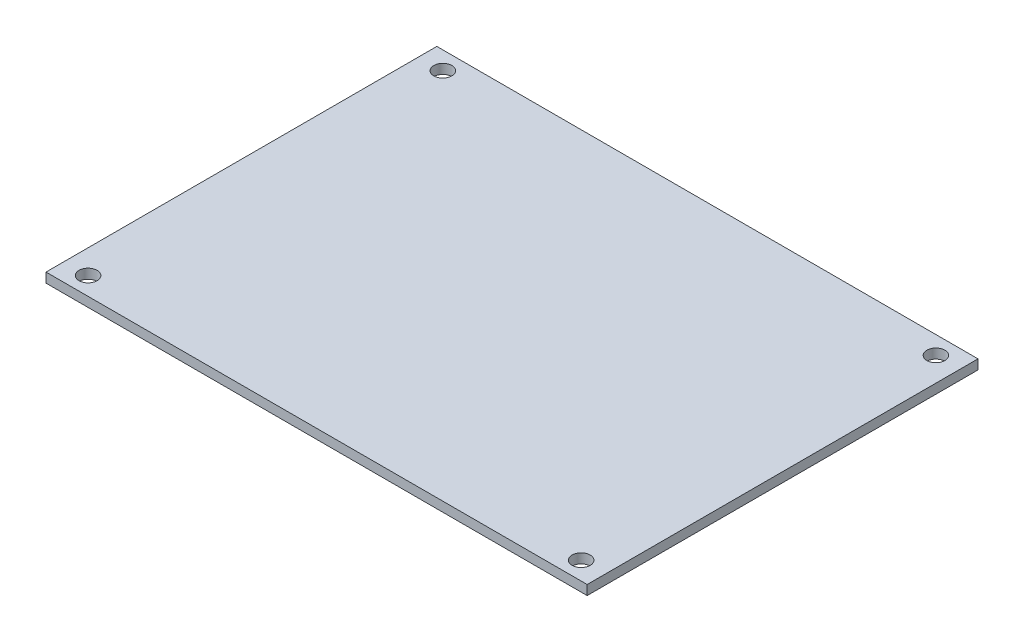
ISO-10303-21;
HEADER;
FILE_DESCRIPTION(('STEP AP214'),'2;1');
FILE_NAME('part.step','',(''),(''),'','','');
FILE_SCHEMA(('AUTOMOTIVE_DESIGN { 1 0 10303 214 1 1 1 1 }'));
ENDSEC;
DATA;
#1=APPLICATION_CONTEXT('core data for automotive mechanical design processes');
#2=APPLICATION_PROTOCOL_DEFINITION('international standard','automotive_design',2000,#1);
#3=PRODUCT_CONTEXT('',#1,'mechanical');
#4=PRODUCT('Part','Part','',(#3));
#5=PRODUCT_RELATED_PRODUCT_CATEGORY('part','',(#4));
#6=PRODUCT_DEFINITION_FORMATION('','',#4);
#7=PRODUCT_DEFINITION_CONTEXT('part definition',#1,'design');
#8=PRODUCT_DEFINITION('design','',#6,#7);
#9=PRODUCT_DEFINITION_SHAPE('','',#8);
#10=(LENGTH_UNIT() NAMED_UNIT(*) SI_UNIT(.MILLI.,.METRE.));
#11=(NAMED_UNIT(*) PLANE_ANGLE_UNIT() SI_UNIT($,.RADIAN.));
#12=(NAMED_UNIT(*) SI_UNIT($,.STERADIAN.) SOLID_ANGLE_UNIT());
#13=UNCERTAINTY_MEASURE_WITH_UNIT(LENGTH_MEASURE(1.E-05),#10,'distance_accuracy_value','');
#14=(GEOMETRIC_REPRESENTATION_CONTEXT(3) GLOBAL_UNCERTAINTY_ASSIGNED_CONTEXT((#13)) GLOBAL_UNIT_ASSIGNED_CONTEXT((#10,
#11,#12)) REPRESENTATION_CONTEXT('',''));
#15=CARTESIAN_POINT('',(0.,0.,0.));
#16=DIRECTION('',(0.,0.,1.));
#17=DIRECTION('',(1.,0.,0.));
#18=AXIS2_PLACEMENT_3D('',#15,#16,#17);
#19=CARTESIAN_POINT('',(0.,1.6,0.));
#20=DIRECTION('',(0.,-1.,0.));
#21=DIRECTION('',(0.,0.,-1.));
#22=AXIS2_PLACEMENT_3D('',#19,#20,#21);
#23=PLANE('',#22);
#24=DIRECTION('',(0.,0.,1.));
#25=VECTOR('',#24,1.);
#26=CARTESIAN_POINT('',(0.,1.6,0.));
#27=LINE('',#26,#25);
#28=CARTESIAN_POINT('',(0.,1.6,-65.));
#29=VERTEX_POINT('',#28);
#30=CARTESIAN_POINT('',(0.,1.6,0.));
#31=VERTEX_POINT('',#30);
#32=EDGE_CURVE('E92',#29,#31,#27,.T.);
#33=ORIENTED_EDGE('',*,*,#32,.T.);
#34=DIRECTION('',(1.,0.,0.));
#35=VECTOR('',#34,1.);
#36=CARTESIAN_POINT('',(0.,1.6,0.));
#37=LINE('',#36,#35);
#38=CARTESIAN_POINT('',(90.,1.6,0.));
#39=VERTEX_POINT('',#38);
#40=EDGE_CURVE('E87',#31,#39,#37,.T.);
#41=ORIENTED_EDGE('',*,*,#40,.T.);
#42=DIRECTION('',(0.,0.,-1.));
#43=VECTOR('',#42,1.);
#44=CARTESIAN_POINT('',(90.,1.6,0.));
#45=LINE('',#44,#43);
#46=CARTESIAN_POINT('',(90.,1.6,-65.));
#47=VERTEX_POINT('',#46);
#48=EDGE_CURVE('E90',#39,#47,#45,.T.);
#49=ORIENTED_EDGE('',*,*,#48,.T.);
#50=DIRECTION('',(-1.,0.,0.));
#51=VECTOR('',#50,1.);
#52=CARTESIAN_POINT('',(0.,1.6,-65.));
#53=LINE('',#52,#51);
#54=EDGE_CURVE('E57',#47,#29,#53,.T.);
#55=ORIENTED_EDGE('',*,*,#54,.T.);
#56=EDGE_LOOP('',(#33,#41,#49,#55));
#57=FACE_BOUND('',#56,.T.);
#58=CARTESIAN_POINT('',(4.,1.6,-3.));
#59=DIRECTION('',(0.,1.,0.));
#60=DIRECTION('',(0.,0.,1.));
#61=AXIS2_PLACEMENT_3D('',#58,#59,#60);
#62=CIRCLE('',#61,1.5);
#63=CARTESIAN_POINT('',(4.,1.6,-1.5));
#64=VERTEX_POINT('',#63);
#65=EDGE_CURVE('E112',#64,#64,#62,.T.);
#66=ORIENTED_EDGE('',*,*,#65,.F.);
#67=EDGE_LOOP('',(#66));
#68=FACE_BOUND('',#67,.T.);
#69=CARTESIAN_POINT('',(86.,1.6,-3.));
#70=DIRECTION('',(0.,1.,0.));
#71=DIRECTION('',(0.,0.,1.));
#72=AXIS2_PLACEMENT_3D('',#69,#70,#71);
#73=CIRCLE('',#72,1.5);
#74=CARTESIAN_POINT('',(86.,1.6,-1.5));
#75=VERTEX_POINT('',#74);
#76=EDGE_CURVE('E134',#75,#75,#73,.T.);
#77=ORIENTED_EDGE('',*,*,#76,.F.);
#78=EDGE_LOOP('',(#77));
#79=FACE_BOUND('',#78,.T.);
#80=CARTESIAN_POINT('',(4.,1.6,-62.));
#81=DIRECTION('',(0.,1.,0.));
#82=DIRECTION('',(0.,0.,1.));
#83=AXIS2_PLACEMENT_3D('',#80,#81,#82);
#84=CIRCLE('',#83,1.5);
#85=CARTESIAN_POINT('',(4.,1.6,-60.5));
#86=VERTEX_POINT('',#85);
#87=EDGE_CURVE('E142',#86,#86,#84,.T.);
#88=ORIENTED_EDGE('',*,*,#87,.F.);
#89=EDGE_LOOP('',(#88));
#90=FACE_BOUND('',#89,.T.);
#91=CARTESIAN_POINT('',(86.,1.6,-62.));
#92=DIRECTION('',(0.,1.,0.));
#93=DIRECTION('',(0.,0.,1.));
#94=AXIS2_PLACEMENT_3D('',#91,#92,#93);
#95=CIRCLE('',#94,1.5);
#96=CARTESIAN_POINT('',(86.,1.6,-60.5));
#97=VERTEX_POINT('',#96);
#98=EDGE_CURVE('E150',#97,#97,#95,.T.);
#99=ORIENTED_EDGE('',*,*,#98,.F.);
#100=EDGE_LOOP('',(#99));
#101=FACE_BOUND('',#100,.T.);
#102=ADVANCED_FACE('F39',(#57,#68,#79,#90,#101),#23,.F.);
#103=CARTESIAN_POINT('',(0.,0.,0.));
#104=DIRECTION('',(0.,-1.,0.));
#105=DIRECTION('',(0.,0.,-1.));
#106=AXIS2_PLACEMENT_3D('',#103,#104,#105);
#107=PLANE('',#106);
#108=CARTESIAN_POINT('',(4.,0.,-62.));
#109=DIRECTION('',(0.,1.,0.));
#110=DIRECTION('',(0.,0.,1.));
#111=AXIS2_PLACEMENT_3D('',#108,#109,#110);
#112=CIRCLE('',#111,1.5);
#113=CARTESIAN_POINT('',(4.,0.,-60.5));
#114=VERTEX_POINT('',#113);
#115=EDGE_CURVE('E146',#114,#114,#112,.T.);
#116=ORIENTED_EDGE('',*,*,#115,.T.);
#117=EDGE_LOOP('',(#116));
#118=FACE_BOUND('',#117,.T.);
#119=CARTESIAN_POINT('',(4.,0.,-3.));
#120=DIRECTION('',(0.,1.,0.));
#121=DIRECTION('',(0.,0.,1.));
#122=AXIS2_PLACEMENT_3D('',#119,#120,#121);
#123=CIRCLE('',#122,1.5);
#124=CARTESIAN_POINT('',(4.,0.,-1.5));
#125=VERTEX_POINT('',#124);
#126=EDGE_CURVE('E130',#125,#125,#123,.T.);
#127=ORIENTED_EDGE('',*,*,#126,.T.);
#128=EDGE_LOOP('',(#127));
#129=FACE_BOUND('',#128,.T.);
#130=DIRECTION('',(0.,0.,1.));
#131=VECTOR('',#130,1.);
#132=CARTESIAN_POINT('',(0.,0.,0.));
#133=LINE('',#132,#131);
#134=CARTESIAN_POINT('',(0.,0.,-65.));
#135=VERTEX_POINT('',#134);
#136=CARTESIAN_POINT('',(0.,0.,0.));
#137=VERTEX_POINT('',#136);
#138=EDGE_CURVE('E108',#135,#137,#133,.T.);
#139=ORIENTED_EDGE('',*,*,#138,.F.);
#140=DIRECTION('',(-1.,0.,0.));
#141=VECTOR('',#140,1.);
#142=CARTESIAN_POINT('',(0.,0.,-65.));
#143=LINE('',#142,#141);
#144=CARTESIAN_POINT('',(90.,0.,-65.));
#145=VERTEX_POINT('',#144);
#146=EDGE_CURVE('E80',#145,#135,#143,.T.);
#147=ORIENTED_EDGE('',*,*,#146,.F.);
#148=DIRECTION('',(0.,0.,-1.));
#149=VECTOR('',#148,1.);
#150=CARTESIAN_POINT('',(90.,0.,0.));
#151=LINE('',#150,#149);
#152=CARTESIAN_POINT('',(90.,0.,0.));
#153=VERTEX_POINT('',#152);
#154=EDGE_CURVE('E74',#153,#145,#151,.T.);
#155=ORIENTED_EDGE('',*,*,#154,.F.);
#156=DIRECTION('',(1.,0.,0.));
#157=VECTOR('',#156,1.);
#158=CARTESIAN_POINT('',(0.,0.,0.));
#159=LINE('',#158,#157);
#160=EDGE_CURVE('E97',#137,#153,#159,.T.);
#161=ORIENTED_EDGE('',*,*,#160,.F.);
#162=EDGE_LOOP('',(#139,#147,#155,#161));
#163=FACE_BOUND('',#162,.T.);
#164=CARTESIAN_POINT('',(86.,0.,-3.));
#165=DIRECTION('',(0.,1.,0.));
#166=DIRECTION('',(0.,0.,1.));
#167=AXIS2_PLACEMENT_3D('',#164,#165,#166);
#168=CIRCLE('',#167,1.5);
#169=CARTESIAN_POINT('',(86.,0.,-1.5));
#170=VERTEX_POINT('',#169);
#171=EDGE_CURVE('E138',#170,#170,#168,.T.);
#172=ORIENTED_EDGE('',*,*,#171,.T.);
#173=EDGE_LOOP('',(#172));
#174=FACE_BOUND('',#173,.T.);
#175=CARTESIAN_POINT('',(86.,0.,-62.));
#176=DIRECTION('',(0.,1.,0.));
#177=DIRECTION('',(0.,0.,1.));
#178=AXIS2_PLACEMENT_3D('',#175,#176,#177);
#179=CIRCLE('',#178,1.5);
#180=CARTESIAN_POINT('',(86.,0.,-60.5));
#181=VERTEX_POINT('',#180);
#182=EDGE_CURVE('E154',#181,#181,#179,.T.);
#183=ORIENTED_EDGE('',*,*,#182,.T.);
#184=EDGE_LOOP('',(#183));
#185=FACE_BOUND('',#184,.T.);
#186=ADVANCED_FACE('F125',(#118,#129,#163,#174,#185),#107,.T.);
#187=CARTESIAN_POINT('',(0.,1.6,0.));
#188=DIRECTION('',(1.,0.,0.));
#189=DIRECTION('',(0.,0.,-1.));
#190=AXIS2_PLACEMENT_3D('',#187,#188,#189);
#191=PLANE('',#190);
#192=ORIENTED_EDGE('',*,*,#138,.T.);
#193=DIRECTION('',(0.,-1.,0.));
#194=VECTOR('',#193,1.);
#195=CARTESIAN_POINT('',(0.,1.6,0.));
#196=LINE('',#195,#194);
#197=EDGE_CURVE('E11',#31,#137,#196,.T.);
#198=ORIENTED_EDGE('',*,*,#197,.F.);
#199=ORIENTED_EDGE('',*,*,#32,.F.);
#200=DIRECTION('',(0.,-1.,0.));
#201=VECTOR('',#200,1.);
#202=CARTESIAN_POINT('',(0.,1.6,-65.));
#203=LINE('',#202,#201);
#204=EDGE_CURVE('E104',#29,#135,#203,.T.);
#205=ORIENTED_EDGE('',*,*,#204,.T.);
#206=EDGE_LOOP('',(#192,#198,#199,#205));
#207=FACE_BOUND('',#206,.T.);
#208=ADVANCED_FACE('F41',(#207),#191,.F.);
#209=CARTESIAN_POINT('',(0.,1.6,0.));
#210=DIRECTION('',(0.,0.,-1.));
#211=DIRECTION('',(-1.,0.,0.));
#212=AXIS2_PLACEMENT_3D('',#209,#210,#211);
#213=PLANE('',#212);
#214=ORIENTED_EDGE('',*,*,#160,.T.);
#215=DIRECTION('',(0.,-1.,0.));
#216=VECTOR('',#215,1.);
#217=CARTESIAN_POINT('',(90.,1.6,0.));
#218=LINE('',#217,#216);
#219=EDGE_CURVE('E49',#39,#153,#218,.T.);
#220=ORIENTED_EDGE('',*,*,#219,.F.);
#221=ORIENTED_EDGE('',*,*,#40,.F.);
#222=ORIENTED_EDGE('',*,*,#197,.T.);
#223=EDGE_LOOP('',(#214,#220,#221,#222));
#224=FACE_BOUND('',#223,.T.);
#225=ADVANCED_FACE('F96',(#224),#213,.F.);
#226=CARTESIAN_POINT('',(90.,1.6,0.));
#227=DIRECTION('',(-1.,0.,0.));
#228=DIRECTION('',(0.,0.,1.));
#229=AXIS2_PLACEMENT_3D('',#226,#227,#228);
#230=PLANE('',#229);
#231=ORIENTED_EDGE('',*,*,#154,.T.);
#232=DIRECTION('',(0.,-1.,0.));
#233=VECTOR('',#232,1.);
#234=CARTESIAN_POINT('',(90.,1.6,-65.));
#235=LINE('',#234,#233);
#236=EDGE_CURVE('E99',#47,#145,#235,.T.);
#237=ORIENTED_EDGE('',*,*,#236,.F.);
#238=ORIENTED_EDGE('',*,*,#48,.F.);
#239=ORIENTED_EDGE('',*,*,#219,.T.);
#240=EDGE_LOOP('',(#231,#237,#238,#239));
#241=FACE_BOUND('',#240,.T.);
#242=ADVANCED_FACE('F100',(#241),#230,.F.);
#243=CARTESIAN_POINT('',(0.,1.6,-65.));
#244=DIRECTION('',(0.,0.,1.));
#245=DIRECTION('',(1.,0.,0.));
#246=AXIS2_PLACEMENT_3D('',#243,#244,#245);
#247=PLANE('',#246);
#248=ORIENTED_EDGE('',*,*,#146,.T.);
#249=ORIENTED_EDGE('',*,*,#204,.F.);
#250=ORIENTED_EDGE('',*,*,#54,.F.);
#251=ORIENTED_EDGE('',*,*,#236,.T.);
#252=EDGE_LOOP('',(#248,#249,#250,#251));
#253=FACE_BOUND('',#252,.T.);
#254=ADVANCED_FACE('F122',(#253),#247,.F.);
#255=CARTESIAN_POINT('',(4.,1.6,-3.));
#256=DIRECTION('',(0.,-1.,0.));
#257=DIRECTION('',(0.,0.,-1.));
#258=AXIS2_PLACEMENT_3D('',#255,#256,#257);
#259=CYLINDRICAL_SURFACE('',#258,1.5);
#260=ORIENTED_EDGE('',*,*,#65,.T.);
#261=EDGE_LOOP('',(#260));
#262=FACE_BOUND('',#261,.T.);
#263=ORIENTED_EDGE('',*,*,#126,.F.);
#264=EDGE_LOOP('',(#263));
#265=FACE_BOUND('',#264,.T.);
#266=ADVANCED_FACE('F173',(#262,#265),#259,.F.);
#267=CARTESIAN_POINT('',(86.,1.6,-3.));
#268=DIRECTION('',(0.,-1.,0.));
#269=DIRECTION('',(0.,0.,-1.));
#270=AXIS2_PLACEMENT_3D('',#267,#268,#269);
#271=CYLINDRICAL_SURFACE('',#270,1.5);
#272=ORIENTED_EDGE('',*,*,#76,.T.);
#273=EDGE_LOOP('',(#272));
#274=FACE_BOUND('',#273,.T.);
#275=ORIENTED_EDGE('',*,*,#171,.F.);
#276=EDGE_LOOP('',(#275));
#277=FACE_BOUND('',#276,.T.);
#278=ADVANCED_FACE('F219',(#274,#277),#271,.F.);
#279=CARTESIAN_POINT('',(4.,1.6,-62.));
#280=DIRECTION('',(0.,-1.,0.));
#281=DIRECTION('',(0.,0.,-1.));
#282=AXIS2_PLACEMENT_3D('',#279,#280,#281);
#283=CYLINDRICAL_SURFACE('',#282,1.5);
#284=ORIENTED_EDGE('',*,*,#87,.T.);
#285=EDGE_LOOP('',(#284));
#286=FACE_BOUND('',#285,.T.);
#287=ORIENTED_EDGE('',*,*,#115,.F.);
#288=EDGE_LOOP('',(#287));
#289=FACE_BOUND('',#288,.T.);
#290=ADVANCED_FACE('F227',(#286,#289),#283,.F.);
#291=CARTESIAN_POINT('',(86.,1.6,-62.));
#292=DIRECTION('',(0.,-1.,0.));
#293=DIRECTION('',(0.,0.,-1.));
#294=AXIS2_PLACEMENT_3D('',#291,#292,#293);
#295=CYLINDRICAL_SURFACE('',#294,1.5);
#296=ORIENTED_EDGE('',*,*,#98,.T.);
#297=EDGE_LOOP('',(#296));
#298=FACE_BOUND('',#297,.T.);
#299=ORIENTED_EDGE('',*,*,#182,.F.);
#300=EDGE_LOOP('',(#299));
#301=FACE_BOUND('',#300,.T.);
#302=ADVANCED_FACE('F162',(#298,#301),#295,.F.);
#303=CLOSED_SHELL('',(#102,#186,#208,#225,#242,#254,#266,#278,#290,#302));
#304=MANIFOLD_SOLID_BREP('B2',#303);
#305=ADVANCED_BREP_SHAPE_REPRESENTATION('',(#18,#304),#14);
#306=SHAPE_DEFINITION_REPRESENTATION(#9,#305);
ENDSEC;
END-ISO-10303-21;
